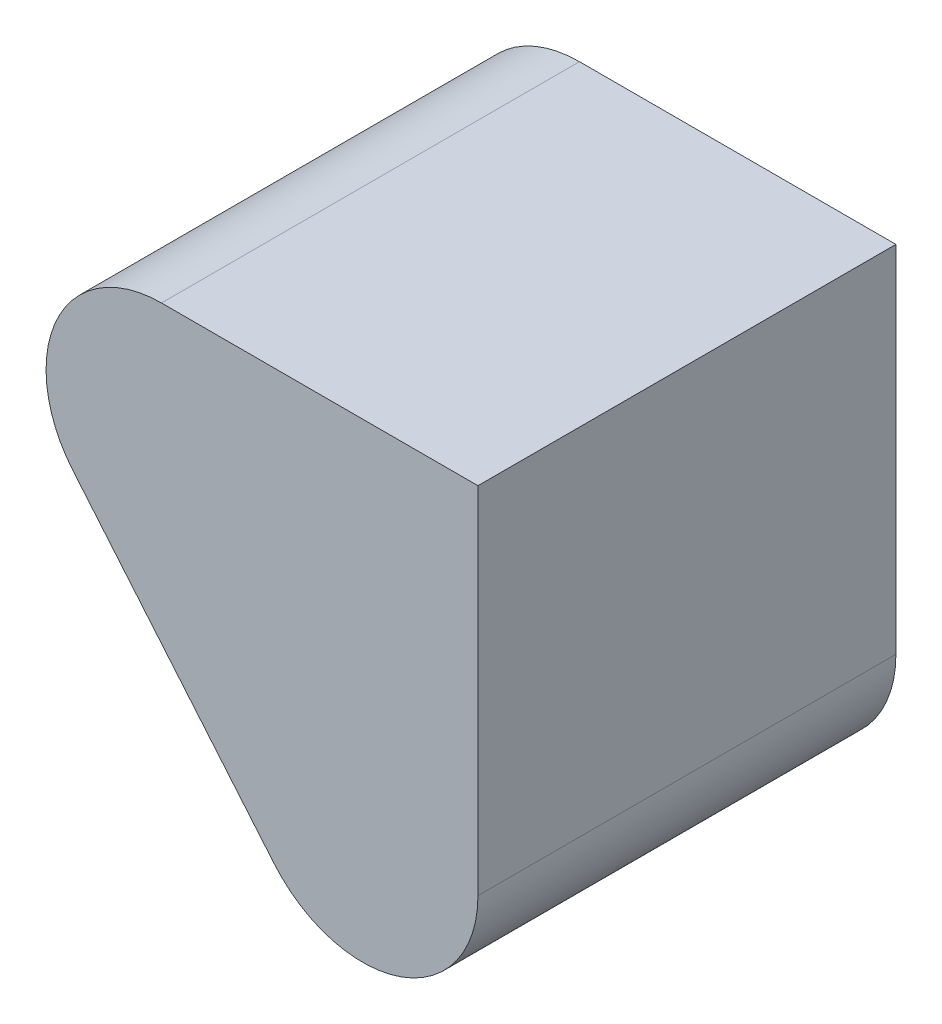
ISO-10303-21;
HEADER;
FILE_DESCRIPTION(('STEP AP214'),'2;1');
FILE_NAME('part.step','',(''),(''),'','','');
FILE_SCHEMA(('AUTOMOTIVE_DESIGN { 1 0 10303 214 1 1 1 1 }'));
ENDSEC;
DATA;
#1=APPLICATION_CONTEXT('core data for automotive mechanical design processes');
#2=APPLICATION_PROTOCOL_DEFINITION('international standard','automotive_design',2000,#1);
#3=PRODUCT_CONTEXT('',#1,'mechanical');
#4=PRODUCT('Part','Part','',(#3));
#5=PRODUCT_RELATED_PRODUCT_CATEGORY('part','',(#4));
#6=PRODUCT_DEFINITION_FORMATION('','',#4);
#7=PRODUCT_DEFINITION_CONTEXT('part definition',#1,'design');
#8=PRODUCT_DEFINITION('design','',#6,#7);
#9=PRODUCT_DEFINITION_SHAPE('','',#8);
#10=(LENGTH_UNIT() NAMED_UNIT(*) SI_UNIT(.MILLI.,.METRE.));
#11=(NAMED_UNIT(*) PLANE_ANGLE_UNIT() SI_UNIT($,.RADIAN.));
#12=(NAMED_UNIT(*) SI_UNIT($,.STERADIAN.) SOLID_ANGLE_UNIT());
#13=UNCERTAINTY_MEASURE_WITH_UNIT(LENGTH_MEASURE(1.E-05),#10,'distance_accuracy_value','');
#14=(GEOMETRIC_REPRESENTATION_CONTEXT(3) GLOBAL_UNCERTAINTY_ASSIGNED_CONTEXT((#13)) GLOBAL_UNIT_ASSIGNED_CONTEXT((#10,
#11,#12)) REPRESENTATION_CONTEXT('',''));
#15=CARTESIAN_POINT('',(0.,0.,0.));
#16=DIRECTION('',(0.,0.,1.));
#17=DIRECTION('',(1.,0.,0.));
#18=AXIS2_PLACEMENT_3D('',#15,#16,#17);
#19=CARTESIAN_POINT('',(0.,0.,40.));
#20=DIRECTION('',(0.,0.,-1.));
#21=DIRECTION('',(-1.,0.,0.));
#22=AXIS2_PLACEMENT_3D('',#19,#20,#21);
#23=CYLINDRICAL_SURFACE('',#22,11.0448180243158);
#24=CARTESIAN_POINT('',(0.,0.,0.));
#25=DIRECTION('',(0.,0.,1.));
#26=DIRECTION('',(1.,0.,0.));
#27=AXIS2_PLACEMENT_3D('',#24,#25,#26);
#28=CIRCLE('',#27,11.0448180243158);
#29=CARTESIAN_POINT('',(-8.46082147278743,-7.09947217727271,0.));
#30=VERTEX_POINT('',#29);
#31=CARTESIAN_POINT('',(11.0448180243158,-3.52686277130076E-13,0.));
#32=VERTEX_POINT('',#31);
#33=EDGE_CURVE('E115',#30,#32,#28,.T.);
#34=ORIENTED_EDGE('',*,*,#33,.T.);
#35=DIRECTION('',(0.,0.,-1.));
#36=VECTOR('',#35,1.);
#37=CARTESIAN_POINT('',(11.0448180243158,-3.52686277130076E-13,40.));
#38=LINE('',#37,#36);
#39=CARTESIAN_POINT('',(11.0448180243158,-3.52686277130076E-13,40.));
#40=VERTEX_POINT('',#39);
#41=EDGE_CURVE('E11',#40,#32,#38,.T.);
#42=ORIENTED_EDGE('',*,*,#41,.F.);
#43=CARTESIAN_POINT('',(0.,0.,40.));
#44=DIRECTION('',(0.,0.,1.));
#45=DIRECTION('',(1.,0.,0.));
#46=AXIS2_PLACEMENT_3D('',#43,#44,#45);
#47=CIRCLE('',#46,11.0448180243158);
#48=CARTESIAN_POINT('',(-8.46082147278743,-7.09947217727271,40.));
#49=VERTEX_POINT('',#48);
#50=EDGE_CURVE('E123',#49,#40,#47,.T.);
#51=ORIENTED_EDGE('',*,*,#50,.F.);
#52=DIRECTION('',(0.,0.,-1.));
#53=VECTOR('',#52,1.);
#54=CARTESIAN_POINT('',(-8.46082147278743,-7.09947217727271,40.));
#55=LINE('',#54,#53);
#56=EDGE_CURVE('E111',#49,#30,#55,.T.);
#57=ORIENTED_EDGE('',*,*,#56,.T.);
#58=EDGE_LOOP('',(#34,#42,#51,#57));
#59=FACE_BOUND('',#58,.T.);
#60=ADVANCED_FACE('F41',(#59),#23,.T.);
#61=CARTESIAN_POINT('',(11.0448180243158,-3.52686277130076E-13,40.));
#62=DIRECTION('',(-1.,0.,0.));
#63=DIRECTION('',(0.,-1.,0.));
#64=AXIS2_PLACEMENT_3D('',#61,#62,#63);
#65=PLANE('',#64);
#66=DIRECTION('',(0.,1.,0.));
#67=VECTOR('',#66,1.);
#68=CARTESIAN_POINT('',(11.0448180243158,-3.52686277130076E-13,0.));
#69=LINE('',#68,#67);
#70=CARTESIAN_POINT('',(11.0448180243158,33.9772331230184,0.));
#71=VERTEX_POINT('',#70);
#72=EDGE_CURVE('E118',#32,#71,#69,.T.);
#73=ORIENTED_EDGE('',*,*,#72,.T.);
#74=DIRECTION('',(0.,0.,-1.));
#75=VECTOR('',#74,1.);
#76=CARTESIAN_POINT('',(11.0448180243158,33.9772331230184,40.));
#77=LINE('',#76,#75);
#78=CARTESIAN_POINT('',(11.0448180243158,33.9772331230184,40.));
#79=VERTEX_POINT('',#78);
#80=EDGE_CURVE('E49',#79,#71,#77,.T.);
#81=ORIENTED_EDGE('',*,*,#80,.F.);
#82=DIRECTION('',(0.,1.,0.));
#83=VECTOR('',#82,1.);
#84=CARTESIAN_POINT('',(11.0448180243158,-3.52686277130076E-13,40.));
#85=LINE('',#84,#83);
#86=EDGE_CURVE('E91',#40,#79,#85,.T.);
#87=ORIENTED_EDGE('',*,*,#86,.F.);
#88=ORIENTED_EDGE('',*,*,#41,.T.);
#89=EDGE_LOOP('',(#73,#81,#87,#88));
#90=FACE_BOUND('',#89,.T.);
#91=ADVANCED_FACE('F142',(#90),#65,.F.);
#92=CARTESIAN_POINT('',(11.0448180243158,33.9772331230184,40.));
#93=DIRECTION('',(0.,-1.,0.));
#94=DIRECTION('',(1.,0.,0.));
#95=AXIS2_PLACEMENT_3D('',#92,#93,#94);
#96=PLANE('',#95);
#97=DIRECTION('',(-1.,0.,0.));
#98=VECTOR('',#97,1.);
#99=CARTESIAN_POINT('',(11.0448180243158,33.9772331230184,0.));
#100=LINE('',#99,#98);
#101=CARTESIAN_POINT('',(-19.2425810513255,33.9772331230183,0.));
#102=VERTEX_POINT('',#101);
#103=EDGE_CURVE('E106',#71,#102,#100,.T.);
#104=ORIENTED_EDGE('',*,*,#103,.T.);
#105=DIRECTION('',(0.,0.,-1.));
#106=VECTOR('',#105,1.);
#107=CARTESIAN_POINT('',(-19.2425810513255,33.9772331230183,40.));
#108=LINE('',#107,#106);
#109=CARTESIAN_POINT('',(-19.2425810513255,33.9772331230183,40.));
#110=VERTEX_POINT('',#109);
#111=EDGE_CURVE('E103',#110,#102,#108,.T.);
#112=ORIENTED_EDGE('',*,*,#111,.F.);
#113=DIRECTION('',(-1.,0.,0.));
#114=VECTOR('',#113,1.);
#115=CARTESIAN_POINT('',(11.0448180243158,33.9772331230184,40.));
#116=LINE('',#115,#114);
#117=EDGE_CURVE('E95',#79,#110,#116,.T.);
#118=ORIENTED_EDGE('',*,*,#117,.F.);
#119=ORIENTED_EDGE('',*,*,#80,.T.);
#120=EDGE_LOOP('',(#104,#112,#118,#119));
#121=FACE_BOUND('',#120,.T.);
#122=ADVANCED_FACE('F104',(#121),#96,.F.);
#123=CARTESIAN_POINT('',(-19.2425810513255,22.9324150987026,40.));
#124=DIRECTION('',(0.,0.,-1.));
#125=DIRECTION('',(-1.,0.,0.));
#126=AXIS2_PLACEMENT_3D('',#123,#124,#125);
#127=CYLINDRICAL_SURFACE('',#126,11.0448180243158);
#128=CARTESIAN_POINT('',(-19.2425810513255,22.9324150987026,0.));
#129=DIRECTION('',(0.,0.,1.));
#130=DIRECTION('',(-1.,0.,0.));
#131=AXIS2_PLACEMENT_3D('',#128,#129,#130);
#132=CIRCLE('',#131,11.0448180243158);
#133=CARTESIAN_POINT('',(-27.703402524113,15.8329429214299,0.));
#134=VERTEX_POINT('',#133);
#135=EDGE_CURVE('E77',#102,#134,#132,.T.);
#136=ORIENTED_EDGE('',*,*,#135,.T.);
#137=DIRECTION('',(0.,0.,-1.));
#138=VECTOR('',#137,1.);
#139=CARTESIAN_POINT('',(-27.703402524113,15.8329429214299,40.));
#140=LINE('',#139,#138);
#141=CARTESIAN_POINT('',(-27.703402524113,15.8329429214299,40.));
#142=VERTEX_POINT('',#141);
#143=EDGE_CURVE('E107',#142,#134,#140,.T.);
#144=ORIENTED_EDGE('',*,*,#143,.F.);
#145=CARTESIAN_POINT('',(-19.2425810513255,22.9324150987026,40.));
#146=DIRECTION('',(0.,0.,1.));
#147=DIRECTION('',(-1.,0.,0.));
#148=AXIS2_PLACEMENT_3D('',#145,#146,#147);
#149=CIRCLE('',#148,11.0448180243158);
#150=EDGE_CURVE('E99',#110,#142,#149,.T.);
#151=ORIENTED_EDGE('',*,*,#150,.F.);
#152=ORIENTED_EDGE('',*,*,#111,.T.);
#153=EDGE_LOOP('',(#136,#144,#151,#152));
#154=FACE_BOUND('',#153,.T.);
#155=ADVANCED_FACE('F109',(#154),#127,.T.);
#156=CARTESIAN_POINT('',(-8.46082147278743,-7.09947217727271,40.));
#157=DIRECTION('',(0.766044443118979,0.642787609686538,0.));
#158=DIRECTION('',(-0.642787609686538,0.766044443118979,0.));
#159=AXIS2_PLACEMENT_3D('',#156,#157,#158);
#160=PLANE('',#159);
#161=DIRECTION('',(0.642787609686538,-0.766044443118979,0.));
#162=VECTOR('',#161,1.);
#163=CARTESIAN_POINT('',(-8.46082147278743,-7.09947217727271,0.));
#164=LINE('',#163,#162);
#165=EDGE_CURVE('E83',#134,#30,#164,.T.);
#166=ORIENTED_EDGE('',*,*,#165,.T.);
#167=ORIENTED_EDGE('',*,*,#56,.F.);
#168=DIRECTION('',(0.642787609686538,-0.766044443118979,0.));
#169=VECTOR('',#168,1.);
#170=CARTESIAN_POINT('',(-8.46082147278743,-7.09947217727271,40.));
#171=LINE('',#170,#169);
#172=EDGE_CURVE('E57',#142,#49,#171,.T.);
#173=ORIENTED_EDGE('',*,*,#172,.F.);
#174=ORIENTED_EDGE('',*,*,#143,.T.);
#175=EDGE_LOOP('',(#166,#167,#173,#174));
#176=FACE_BOUND('',#175,.T.);
#177=ADVANCED_FACE('F131',(#176),#160,.F.);
#178=CARTESIAN_POINT('',(0.,0.,40.));
#179=DIRECTION('',(0.,0.,1.));
#180=DIRECTION('',(1.,0.,0.));
#181=AXIS2_PLACEMENT_3D('',#178,#179,#180);
#182=PLANE('',#181);
#183=ORIENTED_EDGE('',*,*,#50,.T.);
#184=ORIENTED_EDGE('',*,*,#86,.T.);
#185=ORIENTED_EDGE('',*,*,#117,.T.);
#186=ORIENTED_EDGE('',*,*,#150,.T.);
#187=ORIENTED_EDGE('',*,*,#172,.T.);
#188=EDGE_LOOP('',(#183,#184,#185,#186,#187));
#189=FACE_BOUND('',#188,.T.);
#190=ADVANCED_FACE('F97',(#189),#182,.T.);
#191=CARTESIAN_POINT('',(0.,0.,0.));
#192=DIRECTION('',(0.,0.,1.));
#193=DIRECTION('',(1.,0.,0.));
#194=AXIS2_PLACEMENT_3D('',#191,#192,#193);
#195=PLANE('',#194);
#196=ORIENTED_EDGE('',*,*,#33,.F.);
#197=ORIENTED_EDGE('',*,*,#165,.F.);
#198=ORIENTED_EDGE('',*,*,#135,.F.);
#199=ORIENTED_EDGE('',*,*,#103,.F.);
#200=ORIENTED_EDGE('',*,*,#72,.F.);
#201=EDGE_LOOP('',(#196,#197,#198,#199,#200));
#202=FACE_BOUND('',#201,.T.);
#203=ADVANCED_FACE('F127',(#202),#195,.F.);
#204=CLOSED_SHELL('',(#60,#91,#122,#155,#177,#190,#203));
#205=MANIFOLD_SOLID_BREP('B2',#204);
#206=ADVANCED_BREP_SHAPE_REPRESENTATION('',(#18,#205),#14);
#207=SHAPE_DEFINITION_REPRESENTATION(#9,#206);
ENDSEC;
END-ISO-10303-21;
